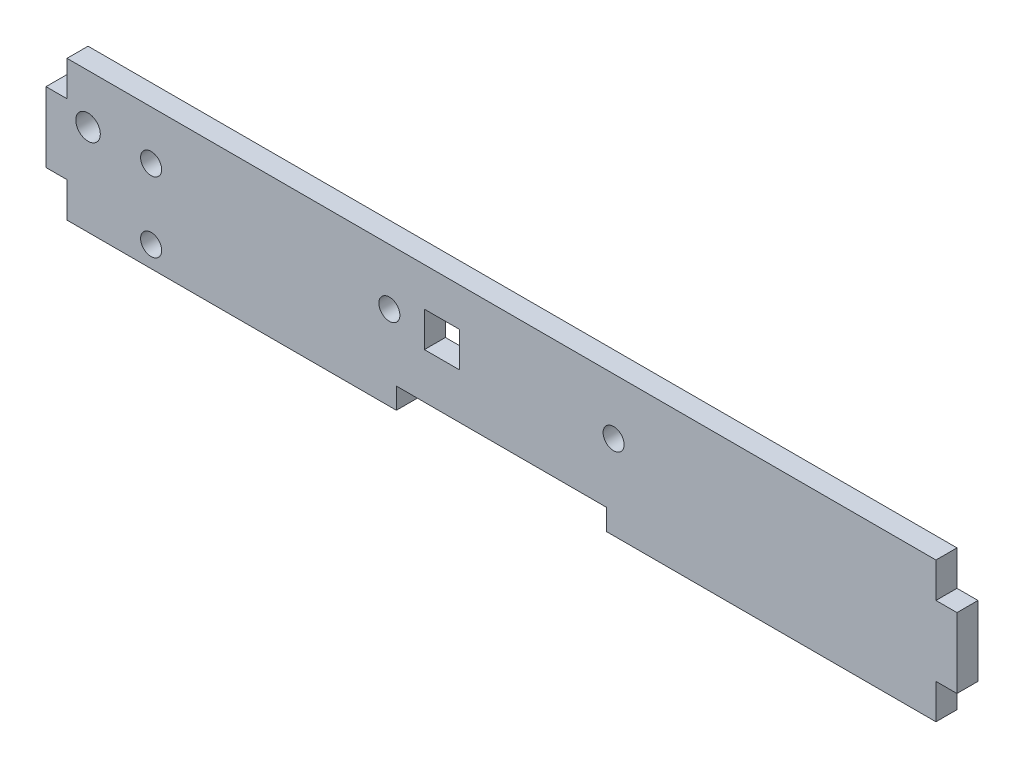
ISO-10303-21;
HEADER;
FILE_DESCRIPTION(('STEP AP214'),'2;1');
FILE_NAME('part.step','',(''),(''),'','','');
FILE_SCHEMA(('AUTOMOTIVE_DESIGN { 1 0 10303 214 1 1 1 1 }'));
ENDSEC;
DATA;
#1=APPLICATION_CONTEXT('core data for automotive mechanical design processes');
#2=APPLICATION_PROTOCOL_DEFINITION('international standard','automotive_design',2000,#1);
#3=PRODUCT_CONTEXT('',#1,'mechanical');
#4=PRODUCT('Part','Part','',(#3));
#5=PRODUCT_RELATED_PRODUCT_CATEGORY('part','',(#4));
#6=PRODUCT_DEFINITION_FORMATION('','',#4);
#7=PRODUCT_DEFINITION_CONTEXT('part definition',#1,'design');
#8=PRODUCT_DEFINITION('design','',#6,#7);
#9=PRODUCT_DEFINITION_SHAPE('','',#8);
#10=(LENGTH_UNIT() NAMED_UNIT(*) SI_UNIT(.MILLI.,.METRE.));
#11=(NAMED_UNIT(*) PLANE_ANGLE_UNIT() SI_UNIT($,.RADIAN.));
#12=(NAMED_UNIT(*) SI_UNIT($,.STERADIAN.) SOLID_ANGLE_UNIT());
#13=UNCERTAINTY_MEASURE_WITH_UNIT(LENGTH_MEASURE(1.E-05),#10,'distance_accuracy_value','');
#14=(GEOMETRIC_REPRESENTATION_CONTEXT(3) GLOBAL_UNCERTAINTY_ASSIGNED_CONTEXT((#13)) GLOBAL_UNIT_ASSIGNED_CONTEXT((#10,
#11,#12)) REPRESENTATION_CONTEXT('',''));
#15=CARTESIAN_POINT('',(0.,0.,0.));
#16=DIRECTION('',(0.,0.,1.));
#17=DIRECTION('',(1.,0.,0.));
#18=AXIS2_PLACEMENT_3D('',#15,#16,#17);
#19=CARTESIAN_POINT('',(0.,10.,3.));
#20=DIRECTION('',(1.,0.,0.));
#21=DIRECTION('',(0.,1.,0.));
#22=AXIS2_PLACEMENT_3D('',#19,#20,#21);
#23=PLANE('',#22);
#24=DIRECTION('',(0.,-1.,0.));
#25=VECTOR('',#24,1.);
#26=CARTESIAN_POINT('',(0.,10.,0.));
#27=LINE('',#26,#25);
#28=CARTESIAN_POINT('',(0.,10.,0.));
#29=VERTEX_POINT('',#28);
#30=CARTESIAN_POINT('',(0.,0.,0.));
#31=VERTEX_POINT('',#30);
#32=EDGE_CURVE('E230',#29,#31,#27,.T.);
#33=ORIENTED_EDGE('',*,*,#32,.T.);
#34=DIRECTION('',(0.,0.,-1.));
#35=VECTOR('',#34,1.);
#36=CARTESIAN_POINT('',(0.,0.,3.));
#37=LINE('',#36,#35);
#38=CARTESIAN_POINT('',(0.,0.,3.));
#39=VERTEX_POINT('',#38);
#40=EDGE_CURVE('E11',#39,#31,#37,.T.);
#41=ORIENTED_EDGE('',*,*,#40,.F.);
#42=DIRECTION('',(0.,-1.,0.));
#43=VECTOR('',#42,1.);
#44=CARTESIAN_POINT('',(0.,10.,3.));
#45=LINE('',#44,#43);
#46=CARTESIAN_POINT('',(0.,10.,3.));
#47=VERTEX_POINT('',#46);
#48=EDGE_CURVE('E233',#47,#39,#45,.T.);
#49=ORIENTED_EDGE('',*,*,#48,.F.);
#50=DIRECTION('',(0.,0.,-1.));
#51=VECTOR('',#50,1.);
#52=CARTESIAN_POINT('',(0.,10.,3.));
#53=LINE('',#52,#51);
#54=EDGE_CURVE('E267',#47,#29,#53,.T.);
#55=ORIENTED_EDGE('',*,*,#54,.T.);
#56=EDGE_LOOP('',(#33,#41,#49,#55));
#57=FACE_BOUND('',#56,.T.);
#58=ADVANCED_FACE('F32',(#57),#23,.F.);
#59=CARTESIAN_POINT('',(0.,0.,3.));
#60=DIRECTION('',(0.,1.,0.));
#61=DIRECTION('',(0.,0.,1.));
#62=AXIS2_PLACEMENT_3D('',#59,#60,#61);
#63=PLANE('',#62);
#64=DIRECTION('',(1.,0.,0.));
#65=VECTOR('',#64,1.);
#66=CARTESIAN_POINT('',(0.,0.,0.));
#67=LINE('',#66,#65);
#68=CARTESIAN_POINT('',(3.,0.,0.));
#69=VERTEX_POINT('',#68);
#70=EDGE_CURVE('E270',#31,#69,#67,.T.);
#71=ORIENTED_EDGE('',*,*,#70,.T.);
#72=DIRECTION('',(0.,0.,-1.));
#73=VECTOR('',#72,1.);
#74=CARTESIAN_POINT('',(3.,0.,3.));
#75=LINE('',#74,#73);
#76=CARTESIAN_POINT('',(3.,0.,3.));
#77=VERTEX_POINT('',#76);
#78=EDGE_CURVE('E39',#77,#69,#75,.T.);
#79=ORIENTED_EDGE('',*,*,#78,.F.);
#80=DIRECTION('',(1.,0.,0.));
#81=VECTOR('',#80,1.);
#82=CARTESIAN_POINT('',(0.,0.,3.));
#83=LINE('',#82,#81);
#84=EDGE_CURVE('E236',#39,#77,#83,.T.);
#85=ORIENTED_EDGE('',*,*,#84,.F.);
#86=ORIENTED_EDGE('',*,*,#40,.T.);
#87=EDGE_LOOP('',(#71,#79,#85,#86));
#88=FACE_BOUND('',#87,.T.);
#89=ADVANCED_FACE('F366',(#88),#63,.F.);
#90=CARTESIAN_POINT('',(3.,0.,3.));
#91=DIRECTION('',(1.,0.,0.));
#92=DIRECTION('',(0.,1.,0.));
#93=AXIS2_PLACEMENT_3D('',#90,#91,#92);
#94=PLANE('',#93);
#95=DIRECTION('',(0.,-1.,0.));
#96=VECTOR('',#95,1.);
#97=CARTESIAN_POINT('',(3.,0.,0.));
#98=LINE('',#97,#96);
#99=CARTESIAN_POINT('',(3.,-5.,0.));
#100=VERTEX_POINT('',#99);
#101=EDGE_CURVE('E272',#69,#100,#98,.T.);
#102=ORIENTED_EDGE('',*,*,#101,.T.);
#103=DIRECTION('',(0.,0.,-1.));
#104=VECTOR('',#103,1.);
#105=CARTESIAN_POINT('',(3.,-5.,3.));
#106=LINE('',#105,#104);
#107=CARTESIAN_POINT('',(3.,-5.,3.));
#108=VERTEX_POINT('',#107);
#109=EDGE_CURVE('E337',#108,#100,#106,.T.);
#110=ORIENTED_EDGE('',*,*,#109,.F.);
#111=DIRECTION('',(0.,-1.,0.));
#112=VECTOR('',#111,1.);
#113=CARTESIAN_POINT('',(3.,0.,3.));
#114=LINE('',#113,#112);
#115=EDGE_CURVE('E239',#77,#108,#114,.T.);
#116=ORIENTED_EDGE('',*,*,#115,.F.);
#117=ORIENTED_EDGE('',*,*,#78,.T.);
#118=EDGE_LOOP('',(#102,#110,#116,#117));
#119=FACE_BOUND('',#118,.T.);
#120=ADVANCED_FACE('F344',(#119),#94,.F.);
#121=CARTESIAN_POINT('',(3.,-5.,3.));
#122=DIRECTION('',(0.,1.,0.));
#123=DIRECTION('',(0.,0.,1.));
#124=AXIS2_PLACEMENT_3D('',#121,#122,#123);
#125=PLANE('',#124);
#126=DIRECTION('',(1.,0.,0.));
#127=VECTOR('',#126,1.);
#128=CARTESIAN_POINT('',(3.,-5.,0.));
#129=LINE('',#128,#127);
#130=CARTESIAN_POINT('',(50.,-5.,0.));
#131=VERTEX_POINT('',#130);
#132=EDGE_CURVE('E274',#100,#131,#129,.T.);
#133=ORIENTED_EDGE('',*,*,#132,.T.);
#134=DIRECTION('',(0.,0.,-1.));
#135=VECTOR('',#134,1.);
#136=CARTESIAN_POINT('',(50.,-5.,3.));
#137=LINE('',#136,#135);
#138=CARTESIAN_POINT('',(50.,-5.,3.));
#139=VERTEX_POINT('',#138);
#140=EDGE_CURVE('E334',#139,#131,#137,.T.);
#141=ORIENTED_EDGE('',*,*,#140,.F.);
#142=DIRECTION('',(1.,0.,0.));
#143=VECTOR('',#142,1.);
#144=CARTESIAN_POINT('',(3.,-5.,3.));
#145=LINE('',#144,#143);
#146=EDGE_CURVE('E241',#108,#139,#145,.T.);
#147=ORIENTED_EDGE('',*,*,#146,.F.);
#148=ORIENTED_EDGE('',*,*,#109,.T.);
#149=EDGE_LOOP('',(#133,#141,#147,#148));
#150=FACE_BOUND('',#149,.T.);
#151=ADVANCED_FACE('F354',(#150),#125,.F.);
#152=CARTESIAN_POINT('',(50.,-5.,3.));
#153=DIRECTION('',(-1.,0.,0.));
#154=DIRECTION('',(0.,0.,1.));
#155=AXIS2_PLACEMENT_3D('',#152,#153,#154);
#156=PLANE('',#155);
#157=DIRECTION('',(0.,1.,0.));
#158=VECTOR('',#157,1.);
#159=CARTESIAN_POINT('',(50.,-5.,0.));
#160=LINE('',#159,#158);
#161=CARTESIAN_POINT('',(50.,-2.,0.));
#162=VERTEX_POINT('',#161);
#163=EDGE_CURVE('E276',#131,#162,#160,.T.);
#164=ORIENTED_EDGE('',*,*,#163,.T.);
#165=DIRECTION('',(0.,0.,-1.));
#166=VECTOR('',#165,1.);
#167=CARTESIAN_POINT('',(50.,-2.,3.));
#168=LINE('',#167,#166);
#169=CARTESIAN_POINT('',(50.,-2.,3.));
#170=VERTEX_POINT('',#169);
#171=EDGE_CURVE('E331',#170,#162,#168,.T.);
#172=ORIENTED_EDGE('',*,*,#171,.F.);
#173=DIRECTION('',(0.,1.,0.));
#174=VECTOR('',#173,1.);
#175=CARTESIAN_POINT('',(50.,-5.,3.));
#176=LINE('',#175,#174);
#177=EDGE_CURVE('E243',#139,#170,#176,.T.);
#178=ORIENTED_EDGE('',*,*,#177,.F.);
#179=ORIENTED_EDGE('',*,*,#140,.T.);
#180=EDGE_LOOP('',(#164,#172,#178,#179));
#181=FACE_BOUND('',#180,.T.);
#182=ADVANCED_FACE('F358',(#181),#156,.F.);
#183=CARTESIAN_POINT('',(50.,-2.,3.));
#184=DIRECTION('',(0.,1.,0.));
#185=DIRECTION('',(-1.,0.,0.));
#186=AXIS2_PLACEMENT_3D('',#183,#184,#185);
#187=PLANE('',#186);
#188=DIRECTION('',(1.,0.,0.));
#189=VECTOR('',#188,1.);
#190=CARTESIAN_POINT('',(50.,-2.,0.));
#191=LINE('',#190,#189);
#192=CARTESIAN_POINT('',(80.,-2.,0.));
#193=VERTEX_POINT('',#192);
#194=EDGE_CURVE('E278',#162,#193,#191,.T.);
#195=ORIENTED_EDGE('',*,*,#194,.T.);
#196=DIRECTION('',(0.,0.,-1.));
#197=VECTOR('',#196,1.);
#198=CARTESIAN_POINT('',(80.,-2.,3.));
#199=LINE('',#198,#197);
#200=CARTESIAN_POINT('',(80.,-2.,3.));
#201=VERTEX_POINT('',#200);
#202=EDGE_CURVE('E328',#201,#193,#199,.T.);
#203=ORIENTED_EDGE('',*,*,#202,.F.);
#204=DIRECTION('',(1.,0.,0.));
#205=VECTOR('',#204,1.);
#206=CARTESIAN_POINT('',(50.,-2.,3.));
#207=LINE('',#206,#205);
#208=EDGE_CURVE('E245',#170,#201,#207,.T.);
#209=ORIENTED_EDGE('',*,*,#208,.F.);
#210=ORIENTED_EDGE('',*,*,#171,.T.);
#211=EDGE_LOOP('',(#195,#203,#209,#210));
#212=FACE_BOUND('',#211,.T.);
#213=ADVANCED_FACE('F419',(#212),#187,.F.);
#214=CARTESIAN_POINT('',(80.,-2.,3.));
#215=DIRECTION('',(1.,0.,0.));
#216=DIRECTION('',(0.,0.,-1.));
#217=AXIS2_PLACEMENT_3D('',#214,#215,#216);
#218=PLANE('',#217);
#219=DIRECTION('',(0.,-1.,0.));
#220=VECTOR('',#219,1.);
#221=CARTESIAN_POINT('',(80.,-2.,0.));
#222=LINE('',#221,#220);
#223=CARTESIAN_POINT('',(80.,-5.,0.));
#224=VERTEX_POINT('',#223);
#225=EDGE_CURVE('E280',#193,#224,#222,.T.);
#226=ORIENTED_EDGE('',*,*,#225,.T.);
#227=DIRECTION('',(0.,0.,-1.));
#228=VECTOR('',#227,1.);
#229=CARTESIAN_POINT('',(80.,-5.,3.));
#230=LINE('',#229,#228);
#231=CARTESIAN_POINT('',(80.,-5.,3.));
#232=VERTEX_POINT('',#231);
#233=EDGE_CURVE('E325',#232,#224,#230,.T.);
#234=ORIENTED_EDGE('',*,*,#233,.F.);
#235=DIRECTION('',(0.,-1.,0.));
#236=VECTOR('',#235,1.);
#237=CARTESIAN_POINT('',(80.,-2.,3.));
#238=LINE('',#237,#236);
#239=EDGE_CURVE('E247',#201,#232,#238,.T.);
#240=ORIENTED_EDGE('',*,*,#239,.F.);
#241=ORIENTED_EDGE('',*,*,#202,.T.);
#242=EDGE_LOOP('',(#226,#234,#240,#241));
#243=FACE_BOUND('',#242,.T.);
#244=ADVANCED_FACE('F416',(#243),#218,.F.);
#245=CARTESIAN_POINT('',(80.,-5.,3.));
#246=DIRECTION('',(0.,1.,0.));
#247=DIRECTION('',(0.,0.,1.));
#248=AXIS2_PLACEMENT_3D('',#245,#246,#247);
#249=PLANE('',#248);
#250=DIRECTION('',(1.,0.,0.));
#251=VECTOR('',#250,1.);
#252=CARTESIAN_POINT('',(80.,-5.,0.));
#253=LINE('',#252,#251);
#254=CARTESIAN_POINT('',(127.,-5.,0.));
#255=VERTEX_POINT('',#254);
#256=EDGE_CURVE('E282',#224,#255,#253,.T.);
#257=ORIENTED_EDGE('',*,*,#256,.T.);
#258=DIRECTION('',(0.,0.,-1.));
#259=VECTOR('',#258,1.);
#260=CARTESIAN_POINT('',(127.,-5.,3.));
#261=LINE('',#260,#259);
#262=CARTESIAN_POINT('',(127.,-5.,3.));
#263=VERTEX_POINT('',#262);
#264=EDGE_CURVE('E322',#263,#255,#261,.T.);
#265=ORIENTED_EDGE('',*,*,#264,.F.);
#266=DIRECTION('',(1.,0.,0.));
#267=VECTOR('',#266,1.);
#268=CARTESIAN_POINT('',(80.,-5.,3.));
#269=LINE('',#268,#267);
#270=EDGE_CURVE('E249',#232,#263,#269,.T.);
#271=ORIENTED_EDGE('',*,*,#270,.F.);
#272=ORIENTED_EDGE('',*,*,#233,.T.);
#273=EDGE_LOOP('',(#257,#265,#271,#272));
#274=FACE_BOUND('',#273,.T.);
#275=ADVANCED_FACE('F412',(#274),#249,.F.);
#276=CARTESIAN_POINT('',(127.,-5.,3.));
#277=DIRECTION('',(-1.,0.,0.));
#278=DIRECTION('',(0.,-1.,0.));
#279=AXIS2_PLACEMENT_3D('',#276,#277,#278);
#280=PLANE('',#279);
#281=DIRECTION('',(0.,1.,0.));
#282=VECTOR('',#281,1.);
#283=CARTESIAN_POINT('',(127.,-5.,0.));
#284=LINE('',#283,#282);
#285=CARTESIAN_POINT('',(127.,0.,0.));
#286=VERTEX_POINT('',#285);
#287=EDGE_CURVE('E284',#255,#286,#284,.T.);
#288=ORIENTED_EDGE('',*,*,#287,.T.);
#289=DIRECTION('',(0.,0.,-1.));
#290=VECTOR('',#289,1.);
#291=CARTESIAN_POINT('',(127.,0.,3.));
#292=LINE('',#291,#290);
#293=CARTESIAN_POINT('',(127.,0.,3.));
#294=VERTEX_POINT('',#293);
#295=EDGE_CURVE('E319',#294,#286,#292,.T.);
#296=ORIENTED_EDGE('',*,*,#295,.F.);
#297=DIRECTION('',(0.,1.,0.));
#298=VECTOR('',#297,1.);
#299=CARTESIAN_POINT('',(127.,-5.,3.));
#300=LINE('',#299,#298);
#301=EDGE_CURVE('E251',#263,#294,#300,.T.);
#302=ORIENTED_EDGE('',*,*,#301,.F.);
#303=ORIENTED_EDGE('',*,*,#264,.T.);
#304=EDGE_LOOP('',(#288,#296,#302,#303));
#305=FACE_BOUND('',#304,.T.);
#306=ADVANCED_FACE('F408',(#305),#280,.F.);
#307=CARTESIAN_POINT('',(127.,0.,3.));
#308=DIRECTION('',(0.,1.,0.));
#309=DIRECTION('',(0.,0.,1.));
#310=AXIS2_PLACEMENT_3D('',#307,#308,#309);
#311=PLANE('',#310);
#312=DIRECTION('',(1.,0.,0.));
#313=VECTOR('',#312,1.);
#314=CARTESIAN_POINT('',(127.,0.,0.));
#315=LINE('',#314,#313);
#316=CARTESIAN_POINT('',(130.,0.,0.));
#317=VERTEX_POINT('',#316);
#318=EDGE_CURVE('E286',#286,#317,#315,.T.);
#319=ORIENTED_EDGE('',*,*,#318,.T.);
#320=DIRECTION('',(0.,0.,-1.));
#321=VECTOR('',#320,1.);
#322=CARTESIAN_POINT('',(130.,0.,3.));
#323=LINE('',#322,#321);
#324=CARTESIAN_POINT('',(130.,0.,3.));
#325=VERTEX_POINT('',#324);
#326=EDGE_CURVE('E316',#325,#317,#323,.T.);
#327=ORIENTED_EDGE('',*,*,#326,.F.);
#328=DIRECTION('',(1.,0.,0.));
#329=VECTOR('',#328,1.);
#330=CARTESIAN_POINT('',(127.,0.,3.));
#331=LINE('',#330,#329);
#332=EDGE_CURVE('E253',#294,#325,#331,.T.);
#333=ORIENTED_EDGE('',*,*,#332,.F.);
#334=ORIENTED_EDGE('',*,*,#295,.T.);
#335=EDGE_LOOP('',(#319,#327,#333,#334));
#336=FACE_BOUND('',#335,.T.);
#337=ADVANCED_FACE('F403',(#336),#311,.F.);
#338=CARTESIAN_POINT('',(130.,0.,3.));
#339=DIRECTION('',(-1.,0.,0.));
#340=DIRECTION('',(0.,0.,1.));
#341=AXIS2_PLACEMENT_3D('',#338,#339,#340);
#342=PLANE('',#341);
#343=DIRECTION('',(0.,1.,0.));
#344=VECTOR('',#343,1.);
#345=CARTESIAN_POINT('',(130.,0.,0.));
#346=LINE('',#345,#344);
#347=CARTESIAN_POINT('',(130.,10.,0.));
#348=VERTEX_POINT('',#347);
#349=EDGE_CURVE('E288',#317,#348,#346,.T.);
#350=ORIENTED_EDGE('',*,*,#349,.T.);
#351=DIRECTION('',(0.,0.,-1.));
#352=VECTOR('',#351,1.);
#353=CARTESIAN_POINT('',(130.,10.,3.));
#354=LINE('',#353,#352);
#355=CARTESIAN_POINT('',(130.,10.,3.));
#356=VERTEX_POINT('',#355);
#357=EDGE_CURVE('E313',#356,#348,#354,.T.);
#358=ORIENTED_EDGE('',*,*,#357,.F.);
#359=DIRECTION('',(0.,1.,0.));
#360=VECTOR('',#359,1.);
#361=CARTESIAN_POINT('',(130.,0.,3.));
#362=LINE('',#361,#360);
#363=EDGE_CURVE('E255',#325,#356,#362,.T.);
#364=ORIENTED_EDGE('',*,*,#363,.F.);
#365=ORIENTED_EDGE('',*,*,#326,.T.);
#366=EDGE_LOOP('',(#350,#358,#364,#365));
#367=FACE_BOUND('',#366,.T.);
#368=ADVANCED_FACE('F397',(#367),#342,.F.);
#369=CARTESIAN_POINT('',(130.,10.,3.));
#370=DIRECTION('',(0.,-1.,0.));
#371=DIRECTION('',(0.,0.,-1.));
#372=AXIS2_PLACEMENT_3D('',#369,#370,#371);
#373=PLANE('',#372);
#374=DIRECTION('',(-1.,0.,0.));
#375=VECTOR('',#374,1.);
#376=CARTESIAN_POINT('',(130.,10.,0.));
#377=LINE('',#376,#375);
#378=CARTESIAN_POINT('',(127.,10.,0.));
#379=VERTEX_POINT('',#378);
#380=EDGE_CURVE('E290',#348,#379,#377,.T.);
#381=ORIENTED_EDGE('',*,*,#380,.T.);
#382=DIRECTION('',(0.,0.,-1.));
#383=VECTOR('',#382,1.);
#384=CARTESIAN_POINT('',(127.,10.,3.));
#385=LINE('',#384,#383);
#386=CARTESIAN_POINT('',(127.,10.,3.));
#387=VERTEX_POINT('',#386);
#388=EDGE_CURVE('E310',#387,#379,#385,.T.);
#389=ORIENTED_EDGE('',*,*,#388,.F.);
#390=DIRECTION('',(-1.,0.,0.));
#391=VECTOR('',#390,1.);
#392=CARTESIAN_POINT('',(130.,10.,3.));
#393=LINE('',#392,#391);
#394=EDGE_CURVE('E257',#356,#387,#393,.T.);
#395=ORIENTED_EDGE('',*,*,#394,.F.);
#396=ORIENTED_EDGE('',*,*,#357,.T.);
#397=EDGE_LOOP('',(#381,#389,#395,#396));
#398=FACE_BOUND('',#397,.T.);
#399=ADVANCED_FACE('F393',(#398),#373,.F.);
#400=CARTESIAN_POINT('',(127.,10.,3.));
#401=DIRECTION('',(-1.,0.,0.));
#402=DIRECTION('',(0.,0.,1.));
#403=AXIS2_PLACEMENT_3D('',#400,#401,#402);
#404=PLANE('',#403);
#405=DIRECTION('',(0.,1.,0.));
#406=VECTOR('',#405,1.);
#407=CARTESIAN_POINT('',(127.,10.,0.));
#408=LINE('',#407,#406);
#409=CARTESIAN_POINT('',(127.,15.,0.));
#410=VERTEX_POINT('',#409);
#411=EDGE_CURVE('E292',#379,#410,#408,.T.);
#412=ORIENTED_EDGE('',*,*,#411,.T.);
#413=DIRECTION('',(0.,0.,-1.));
#414=VECTOR('',#413,1.);
#415=CARTESIAN_POINT('',(127.,15.,3.));
#416=LINE('',#415,#414);
#417=CARTESIAN_POINT('',(127.,15.,3.));
#418=VERTEX_POINT('',#417);
#419=EDGE_CURVE('E307',#418,#410,#416,.T.);
#420=ORIENTED_EDGE('',*,*,#419,.F.);
#421=DIRECTION('',(0.,1.,0.));
#422=VECTOR('',#421,1.);
#423=CARTESIAN_POINT('',(127.,10.,3.));
#424=LINE('',#423,#422);
#425=EDGE_CURVE('E259',#387,#418,#424,.T.);
#426=ORIENTED_EDGE('',*,*,#425,.F.);
#427=ORIENTED_EDGE('',*,*,#388,.T.);
#428=EDGE_LOOP('',(#412,#420,#426,#427));
#429=FACE_BOUND('',#428,.T.);
#430=ADVANCED_FACE('F388',(#429),#404,.F.);
#431=CARTESIAN_POINT('',(127.,15.,3.));
#432=DIRECTION('',(0.,-1.,0.));
#433=DIRECTION('',(1.,0.,0.));
#434=AXIS2_PLACEMENT_3D('',#431,#432,#433);
#435=PLANE('',#434);
#436=DIRECTION('',(-1.,0.,0.));
#437=VECTOR('',#436,1.);
#438=CARTESIAN_POINT('',(127.,15.,0.));
#439=LINE('',#438,#437);
#440=CARTESIAN_POINT('',(3.,15.,0.));
#441=VERTEX_POINT('',#440);
#442=EDGE_CURVE('E294',#410,#441,#439,.T.);
#443=ORIENTED_EDGE('',*,*,#442,.T.);
#444=DIRECTION('',(0.,0.,-1.));
#445=VECTOR('',#444,1.);
#446=CARTESIAN_POINT('',(3.,15.,3.));
#447=LINE('',#446,#445);
#448=CARTESIAN_POINT('',(3.,15.,3.));
#449=VERTEX_POINT('',#448);
#450=EDGE_CURVE('E304',#449,#441,#447,.T.);
#451=ORIENTED_EDGE('',*,*,#450,.F.);
#452=DIRECTION('',(-1.,0.,0.));
#453=VECTOR('',#452,1.);
#454=CARTESIAN_POINT('',(127.,15.,3.));
#455=LINE('',#454,#453);
#456=EDGE_CURVE('E261',#418,#449,#455,.T.);
#457=ORIENTED_EDGE('',*,*,#456,.F.);
#458=ORIENTED_EDGE('',*,*,#419,.T.);
#459=EDGE_LOOP('',(#443,#451,#457,#458));
#460=FACE_BOUND('',#459,.T.);
#461=ADVANCED_FACE('F382',(#460),#435,.F.);
#462=CARTESIAN_POINT('',(3.,15.,3.));
#463=DIRECTION('',(1.,0.,0.));
#464=DIRECTION('',(0.,1.,0.));
#465=AXIS2_PLACEMENT_3D('',#462,#463,#464);
#466=PLANE('',#465);
#467=DIRECTION('',(0.,-1.,0.));
#468=VECTOR('',#467,1.);
#469=CARTESIAN_POINT('',(3.,15.,0.));
#470=LINE('',#469,#468);
#471=CARTESIAN_POINT('',(3.,10.,0.));
#472=VERTEX_POINT('',#471);
#473=EDGE_CURVE('E296',#441,#472,#470,.T.);
#474=ORIENTED_EDGE('',*,*,#473,.T.);
#475=DIRECTION('',(0.,0.,-1.));
#476=VECTOR('',#475,1.);
#477=CARTESIAN_POINT('',(3.,10.,3.));
#478=LINE('',#477,#476);
#479=CARTESIAN_POINT('',(3.,10.,3.));
#480=VERTEX_POINT('',#479);
#481=EDGE_CURVE('E301',#480,#472,#478,.T.);
#482=ORIENTED_EDGE('',*,*,#481,.F.);
#483=DIRECTION('',(0.,-1.,0.));
#484=VECTOR('',#483,1.);
#485=CARTESIAN_POINT('',(3.,15.,3.));
#486=LINE('',#485,#484);
#487=EDGE_CURVE('E263',#449,#480,#486,.T.);
#488=ORIENTED_EDGE('',*,*,#487,.F.);
#489=ORIENTED_EDGE('',*,*,#450,.T.);
#490=EDGE_LOOP('',(#474,#482,#488,#489));
#491=FACE_BOUND('',#490,.T.);
#492=ADVANCED_FACE('F378',(#491),#466,.F.);
#493=CARTESIAN_POINT('',(3.,10.,3.));
#494=DIRECTION('',(0.,-1.,0.));
#495=DIRECTION('',(0.,0.,-1.));
#496=AXIS2_PLACEMENT_3D('',#493,#494,#495);
#497=PLANE('',#496);
#498=DIRECTION('',(-1.,0.,0.));
#499=VECTOR('',#498,1.);
#500=CARTESIAN_POINT('',(3.,10.,0.));
#501=LINE('',#500,#499);
#502=EDGE_CURVE('E237',#472,#29,#501,.T.);
#503=ORIENTED_EDGE('',*,*,#502,.T.);
#504=ORIENTED_EDGE('',*,*,#54,.F.);
#505=DIRECTION('',(-1.,0.,0.));
#506=VECTOR('',#505,1.);
#507=CARTESIAN_POINT('',(3.,10.,3.));
#508=LINE('',#507,#506);
#509=EDGE_CURVE('E265',#480,#47,#508,.T.);
#510=ORIENTED_EDGE('',*,*,#509,.F.);
#511=ORIENTED_EDGE('',*,*,#481,.T.);
#512=EDGE_LOOP('',(#503,#504,#510,#511));
#513=FACE_BOUND('',#512,.T.);
#514=ADVANCED_FACE('F373',(#513),#497,.F.);
#515=CARTESIAN_POINT('',(0.,0.,3.));
#516=DIRECTION('',(0.,0.,1.));
#517=DIRECTION('',(1.,0.,0.));
#518=AXIS2_PLACEMENT_3D('',#515,#516,#517);
#519=PLANE('',#518);
#520=CARTESIAN_POINT('',(81.,7.00000000000002,3.));
#521=DIRECTION('',(0.,0.,1.));
#522=DIRECTION('',(1.,0.,0.));
#523=AXIS2_PLACEMENT_3D('',#520,#521,#522);
#524=CIRCLE('',#523,1.5);
#525=CARTESIAN_POINT('',(82.5,7.00000000000002,3.));
#526=VERTEX_POINT('',#525);
#527=EDGE_CURVE('E192',#526,#526,#524,.T.);
#528=ORIENTED_EDGE('',*,*,#527,.F.);
#529=EDGE_LOOP('',(#528));
#530=FACE_BOUND('',#529,.T.);
#531=DIRECTION('',(0.,-1.,0.));
#532=VECTOR('',#531,1.);
#533=CARTESIAN_POINT('',(54.,9.50000000000002,3.));
#534=LINE('',#533,#532);
#535=CARTESIAN_POINT('',(54.,9.50000000000002,3.));
#536=VERTEX_POINT('',#535);
#537=CARTESIAN_POINT('',(54.,4.50000000000002,3.));
#538=VERTEX_POINT('',#537);
#539=EDGE_CURVE('E46',#536,#538,#534,.T.);
#540=ORIENTED_EDGE('',*,*,#539,.F.);
#541=DIRECTION('',(-1.,0.,0.));
#542=VECTOR('',#541,1.);
#543=CARTESIAN_POINT('',(54.,9.50000000000002,3.));
#544=LINE('',#543,#542);
#545=CARTESIAN_POINT('',(59.,9.50000000000002,3.));
#546=VERTEX_POINT('',#545);
#547=EDGE_CURVE('E186',#546,#536,#544,.T.);
#548=ORIENTED_EDGE('',*,*,#547,.F.);
#549=DIRECTION('',(0.,1.,0.));
#550=VECTOR('',#549,1.);
#551=CARTESIAN_POINT('',(59.,9.50000000000002,3.));
#552=LINE('',#551,#550);
#553=CARTESIAN_POINT('',(59.,4.50000000000002,3.));
#554=VERTEX_POINT('',#553);
#555=EDGE_CURVE('E189',#554,#546,#552,.T.);
#556=ORIENTED_EDGE('',*,*,#555,.F.);
#557=DIRECTION('',(1.,0.,0.));
#558=VECTOR('',#557,1.);
#559=CARTESIAN_POINT('',(54.,4.50000000000002,3.));
#560=LINE('',#559,#558);
#561=EDGE_CURVE('E198',#538,#554,#560,.T.);
#562=ORIENTED_EDGE('',*,*,#561,.F.);
#563=EDGE_LOOP('',(#540,#548,#556,#562));
#564=FACE_BOUND('',#563,.T.);
#565=CARTESIAN_POINT('',(49.,7.00000000000002,3.));
#566=DIRECTION('',(0.,0.,1.));
#567=DIRECTION('',(1.,0.,0.));
#568=AXIS2_PLACEMENT_3D('',#565,#566,#567);
#569=CIRCLE('',#568,1.5);
#570=CARTESIAN_POINT('',(50.5,7.00000000000002,3.));
#571=VERTEX_POINT('',#570);
#572=EDGE_CURVE('E211',#571,#571,#569,.T.);
#573=ORIENTED_EDGE('',*,*,#572,.F.);
#574=EDGE_LOOP('',(#573));
#575=FACE_BOUND('',#574,.T.);
#576=CARTESIAN_POINT('',(15.,-2.,3.));
#577=DIRECTION('',(0.,0.,1.));
#578=DIRECTION('',(1.,0.,0.));
#579=AXIS2_PLACEMENT_3D('',#576,#577,#578);
#580=CIRCLE('',#579,1.5);
#581=CARTESIAN_POINT('',(16.5,-2.,3.));
#582=VERTEX_POINT('',#581);
#583=EDGE_CURVE('E219',#582,#582,#580,.T.);
#584=ORIENTED_EDGE('',*,*,#583,.F.);
#585=EDGE_LOOP('',(#584));
#586=FACE_BOUND('',#585,.T.);
#587=CARTESIAN_POINT('',(6.,8.00000000000001,3.));
#588=DIRECTION('',(0.,0.,1.));
#589=DIRECTION('',(1.,0.,0.));
#590=AXIS2_PLACEMENT_3D('',#587,#588,#589);
#591=CIRCLE('',#590,1.75);
#592=CARTESIAN_POINT('',(7.75,8.00000000000001,3.));
#593=VERTEX_POINT('',#592);
#594=EDGE_CURVE('E210',#593,#593,#591,.T.);
#595=ORIENTED_EDGE('',*,*,#594,.F.);
#596=EDGE_LOOP('',(#595));
#597=FACE_BOUND('',#596,.T.);
#598=CARTESIAN_POINT('',(15.,8.,3.));
#599=DIRECTION('',(0.,0.,1.));
#600=DIRECTION('',(1.,0.,0.));
#601=AXIS2_PLACEMENT_3D('',#598,#599,#600);
#602=CIRCLE('',#601,1.5);
#603=CARTESIAN_POINT('',(16.5,8.,3.));
#604=VERTEX_POINT('',#603);
#605=EDGE_CURVE('E218',#604,#604,#602,.T.);
#606=ORIENTED_EDGE('',*,*,#605,.F.);
#607=EDGE_LOOP('',(#606));
#608=FACE_BOUND('',#607,.T.);
#609=ORIENTED_EDGE('',*,*,#48,.T.);
#610=ORIENTED_EDGE('',*,*,#84,.T.);
#611=ORIENTED_EDGE('',*,*,#115,.T.);
#612=ORIENTED_EDGE('',*,*,#146,.T.);
#613=ORIENTED_EDGE('',*,*,#177,.T.);
#614=ORIENTED_EDGE('',*,*,#208,.T.);
#615=ORIENTED_EDGE('',*,*,#239,.T.);
#616=ORIENTED_EDGE('',*,*,#270,.T.);
#617=ORIENTED_EDGE('',*,*,#301,.T.);
#618=ORIENTED_EDGE('',*,*,#332,.T.);
#619=ORIENTED_EDGE('',*,*,#363,.T.);
#620=ORIENTED_EDGE('',*,*,#394,.T.);
#621=ORIENTED_EDGE('',*,*,#425,.T.);
#622=ORIENTED_EDGE('',*,*,#456,.T.);
#623=ORIENTED_EDGE('',*,*,#487,.T.);
#624=ORIENTED_EDGE('',*,*,#509,.T.);
#625=EDGE_LOOP('',(#609,#610,#611,#612,#613,#614,#615,#616,#617,#618,#619,#620,#621,#622,#623,#624));
#626=FACE_BOUND('',#625,.T.);
#627=ADVANCED_FACE('F362',(#530,#564,#575,#586,#597,#608,#626),#519,.T.);
#628=CARTESIAN_POINT('',(0.,0.,0.));
#629=DIRECTION('',(0.,0.,1.));
#630=DIRECTION('',(1.,0.,0.));
#631=AXIS2_PLACEMENT_3D('',#628,#629,#630);
#632=PLANE('',#631);
#633=CARTESIAN_POINT('',(81.,7.00000000000002,0.));
#634=DIRECTION('',(0.,0.,1.));
#635=DIRECTION('',(1.,0.,0.));
#636=AXIS2_PLACEMENT_3D('',#633,#634,#635);
#637=CIRCLE('',#636,1.5);
#638=CARTESIAN_POINT('',(82.5,7.00000000000002,0.));
#639=VERTEX_POINT('',#638);
#640=EDGE_CURVE('E214',#639,#639,#637,.T.);
#641=ORIENTED_EDGE('',*,*,#640,.T.);
#642=EDGE_LOOP('',(#641));
#643=FACE_BOUND('',#642,.T.);
#644=DIRECTION('',(-1.,0.,0.));
#645=VECTOR('',#644,1.);
#646=CARTESIAN_POINT('',(54.,9.50000000000002,0.));
#647=LINE('',#646,#645);
#648=CARTESIAN_POINT('',(59.,9.50000000000002,0.));
#649=VERTEX_POINT('',#648);
#650=CARTESIAN_POINT('',(54.,9.50000000000002,0.));
#651=VERTEX_POINT('',#650);
#652=EDGE_CURVE('E176',#649,#651,#647,.T.);
#653=ORIENTED_EDGE('',*,*,#652,.T.);
#654=DIRECTION('',(0.,-1.,0.));
#655=VECTOR('',#654,1.);
#656=CARTESIAN_POINT('',(54.,9.50000000000002,0.));
#657=LINE('',#656,#655);
#658=CARTESIAN_POINT('',(54.,4.50000000000002,0.));
#659=VERTEX_POINT('',#658);
#660=EDGE_CURVE('E170',#651,#659,#657,.T.);
#661=ORIENTED_EDGE('',*,*,#660,.T.);
#662=DIRECTION('',(1.,0.,0.));
#663=VECTOR('',#662,1.);
#664=CARTESIAN_POINT('',(54.,4.50000000000002,0.));
#665=LINE('',#664,#663);
#666=CARTESIAN_POINT('',(59.,4.50000000000002,0.));
#667=VERTEX_POINT('',#666);
#668=EDGE_CURVE('E179',#659,#667,#665,.T.);
#669=ORIENTED_EDGE('',*,*,#668,.T.);
#670=DIRECTION('',(0.,1.,0.));
#671=VECTOR('',#670,1.);
#672=CARTESIAN_POINT('',(59.,9.50000000000002,0.));
#673=LINE('',#672,#671);
#674=EDGE_CURVE('E54',#667,#649,#673,.T.);
#675=ORIENTED_EDGE('',*,*,#674,.T.);
#676=EDGE_LOOP('',(#653,#661,#669,#675));
#677=FACE_BOUND('',#676,.T.);
#678=CARTESIAN_POINT('',(49.,7.00000000000002,0.));
#679=DIRECTION('',(0.,0.,1.));
#680=DIRECTION('',(1.,0.,0.));
#681=AXIS2_PLACEMENT_3D('',#678,#679,#680);
#682=CIRCLE('',#681,1.5);
#683=CARTESIAN_POINT('',(50.5,7.00000000000002,0.));
#684=VERTEX_POINT('',#683);
#685=EDGE_CURVE('E207',#684,#684,#682,.T.);
#686=ORIENTED_EDGE('',*,*,#685,.T.);
#687=EDGE_LOOP('',(#686));
#688=FACE_BOUND('',#687,.T.);
#689=CARTESIAN_POINT('',(15.,-2.,0.));
#690=DIRECTION('',(0.,0.,1.));
#691=DIRECTION('',(1.,0.,0.));
#692=AXIS2_PLACEMENT_3D('',#689,#690,#691);
#693=CIRCLE('',#692,1.5);
#694=CARTESIAN_POINT('',(16.5,-2.,0.));
#695=VERTEX_POINT('',#694);
#696=EDGE_CURVE('E215',#695,#695,#693,.T.);
#697=ORIENTED_EDGE('',*,*,#696,.T.);
#698=EDGE_LOOP('',(#697));
#699=FACE_BOUND('',#698,.T.);
#700=CARTESIAN_POINT('',(6.,8.00000000000001,0.));
#701=DIRECTION('',(0.,0.,1.));
#702=DIRECTION('',(1.,0.,0.));
#703=AXIS2_PLACEMENT_3D('',#700,#701,#702);
#704=CIRCLE('',#703,1.75);
#705=CARTESIAN_POINT('',(7.75,8.00000000000001,0.));
#706=VERTEX_POINT('',#705);
#707=EDGE_CURVE('E222',#706,#706,#704,.T.);
#708=ORIENTED_EDGE('',*,*,#707,.T.);
#709=EDGE_LOOP('',(#708));
#710=FACE_BOUND('',#709,.T.);
#711=CARTESIAN_POINT('',(15.,8.,0.));
#712=DIRECTION('',(0.,0.,1.));
#713=DIRECTION('',(1.,0.,0.));
#714=AXIS2_PLACEMENT_3D('',#711,#712,#713);
#715=CIRCLE('',#714,1.5);
#716=CARTESIAN_POINT('',(16.5,8.,0.));
#717=VERTEX_POINT('',#716);
#718=EDGE_CURVE('E227',#717,#717,#715,.T.);
#719=ORIENTED_EDGE('',*,*,#718,.T.);
#720=EDGE_LOOP('',(#719));
#721=FACE_BOUND('',#720,.T.);
#722=ORIENTED_EDGE('',*,*,#32,.F.);
#723=ORIENTED_EDGE('',*,*,#502,.F.);
#724=ORIENTED_EDGE('',*,*,#473,.F.);
#725=ORIENTED_EDGE('',*,*,#442,.F.);
#726=ORIENTED_EDGE('',*,*,#411,.F.);
#727=ORIENTED_EDGE('',*,*,#380,.F.);
#728=ORIENTED_EDGE('',*,*,#349,.F.);
#729=ORIENTED_EDGE('',*,*,#318,.F.);
#730=ORIENTED_EDGE('',*,*,#287,.F.);
#731=ORIENTED_EDGE('',*,*,#256,.F.);
#732=ORIENTED_EDGE('',*,*,#225,.F.);
#733=ORIENTED_EDGE('',*,*,#194,.F.);
#734=ORIENTED_EDGE('',*,*,#163,.F.);
#735=ORIENTED_EDGE('',*,*,#132,.F.);
#736=ORIENTED_EDGE('',*,*,#101,.F.);
#737=ORIENTED_EDGE('',*,*,#70,.F.);
#738=EDGE_LOOP('',(#722,#723,#724,#725,#726,#727,#728,#729,#730,#731,#732,#733,#734,#735,#736,#737));
#739=FACE_BOUND('',#738,.T.);
#740=ADVANCED_FACE('F183',(#643,#677,#688,#699,#710,#721,#739),#632,.F.);
#741=CARTESIAN_POINT('',(15.,8.,0.));
#742=DIRECTION('',(0.,0.,1.));
#743=DIRECTION('',(1.,0.,0.));
#744=AXIS2_PLACEMENT_3D('',#741,#742,#743);
#745=CYLINDRICAL_SURFACE('',#744,1.5);
#746=ORIENTED_EDGE('',*,*,#718,.F.);
#747=EDGE_LOOP('',(#746));
#748=FACE_BOUND('',#747,.T.);
#749=ORIENTED_EDGE('',*,*,#605,.T.);
#750=EDGE_LOOP('',(#749));
#751=FACE_BOUND('',#750,.T.);
#752=ADVANCED_FACE('F535',(#748,#751),#745,.F.);
#753=CARTESIAN_POINT('',(6.,8.00000000000001,0.));
#754=DIRECTION('',(0.,0.,1.));
#755=DIRECTION('',(1.,0.,0.));
#756=AXIS2_PLACEMENT_3D('',#753,#754,#755);
#757=CYLINDRICAL_SURFACE('',#756,1.75);
#758=ORIENTED_EDGE('',*,*,#707,.F.);
#759=EDGE_LOOP('',(#758));
#760=FACE_BOUND('',#759,.T.);
#761=ORIENTED_EDGE('',*,*,#594,.T.);
#762=EDGE_LOOP('',(#761));
#763=FACE_BOUND('',#762,.T.);
#764=ADVANCED_FACE('F540',(#760,#763),#757,.F.);
#765=CARTESIAN_POINT('',(15.,-2.,0.));
#766=DIRECTION('',(0.,0.,1.));
#767=DIRECTION('',(1.,0.,0.));
#768=AXIS2_PLACEMENT_3D('',#765,#766,#767);
#769=CYLINDRICAL_SURFACE('',#768,1.5);
#770=ORIENTED_EDGE('',*,*,#696,.F.);
#771=EDGE_LOOP('',(#770));
#772=FACE_BOUND('',#771,.T.);
#773=ORIENTED_EDGE('',*,*,#583,.T.);
#774=EDGE_LOOP('',(#773));
#775=FACE_BOUND('',#774,.T.);
#776=ADVANCED_FACE('F552',(#772,#775),#769,.F.);
#777=CARTESIAN_POINT('',(49.,7.00000000000002,0.));
#778=DIRECTION('',(0.,0.,1.));
#779=DIRECTION('',(1.,0.,0.));
#780=AXIS2_PLACEMENT_3D('',#777,#778,#779);
#781=CYLINDRICAL_SURFACE('',#780,1.5);
#782=ORIENTED_EDGE('',*,*,#685,.F.);
#783=EDGE_LOOP('',(#782));
#784=FACE_BOUND('',#783,.T.);
#785=ORIENTED_EDGE('',*,*,#572,.T.);
#786=EDGE_LOOP('',(#785));
#787=FACE_BOUND('',#786,.T.);
#788=ADVANCED_FACE('F562',(#784,#787),#781,.F.);
#789=CARTESIAN_POINT('',(54.,9.50000000000002,0.));
#790=DIRECTION('',(-1.,0.,0.));
#791=DIRECTION('',(0.,-1.,0.));
#792=AXIS2_PLACEMENT_3D('',#789,#790,#791);
#793=PLANE('',#792);
#794=ORIENTED_EDGE('',*,*,#539,.T.);
#795=DIRECTION('',(0.,0.,1.));
#796=VECTOR('',#795,1.);
#797=CARTESIAN_POINT('',(54.,4.50000000000002,0.));
#798=LINE('',#797,#796);
#799=EDGE_CURVE('E166',#659,#538,#798,.T.);
#800=ORIENTED_EDGE('',*,*,#799,.F.);
#801=ORIENTED_EDGE('',*,*,#660,.F.);
#802=DIRECTION('',(0.,0.,1.));
#803=VECTOR('',#802,1.);
#804=CARTESIAN_POINT('',(54.,9.50000000000002,0.));
#805=LINE('',#804,#803);
#806=EDGE_CURVE('E202',#651,#536,#805,.T.);
#807=ORIENTED_EDGE('',*,*,#806,.T.);
#808=EDGE_LOOP('',(#794,#800,#801,#807));
#809=FACE_BOUND('',#808,.T.);
#810=ADVANCED_FACE('F168',(#809),#793,.F.);
#811=CARTESIAN_POINT('',(54.,9.50000000000002,0.));
#812=DIRECTION('',(0.,1.,0.));
#813=DIRECTION('',(0.,0.,1.));
#814=AXIS2_PLACEMENT_3D('',#811,#812,#813);
#815=PLANE('',#814);
#816=ORIENTED_EDGE('',*,*,#547,.T.);
#817=ORIENTED_EDGE('',*,*,#806,.F.);
#818=ORIENTED_EDGE('',*,*,#652,.F.);
#819=DIRECTION('',(0.,0.,1.));
#820=VECTOR('',#819,1.);
#821=CARTESIAN_POINT('',(59.,9.50000000000002,0.));
#822=LINE('',#821,#820);
#823=EDGE_CURVE('E204',#649,#546,#822,.T.);
#824=ORIENTED_EDGE('',*,*,#823,.T.);
#825=EDGE_LOOP('',(#816,#817,#818,#824));
#826=FACE_BOUND('',#825,.T.);
#827=ADVANCED_FACE('F595',(#826),#815,.F.);
#828=CARTESIAN_POINT('',(59.,9.50000000000002,0.));
#829=DIRECTION('',(1.,0.,0.));
#830=DIRECTION('',(0.,1.,0.));
#831=AXIS2_PLACEMENT_3D('',#828,#829,#830);
#832=PLANE('',#831);
#833=ORIENTED_EDGE('',*,*,#555,.T.);
#834=ORIENTED_EDGE('',*,*,#823,.F.);
#835=ORIENTED_EDGE('',*,*,#674,.F.);
#836=DIRECTION('',(0.,0.,1.));
#837=VECTOR('',#836,1.);
#838=CARTESIAN_POINT('',(59.,4.50000000000002,0.));
#839=LINE('',#838,#837);
#840=EDGE_CURVE('E175',#667,#554,#839,.T.);
#841=ORIENTED_EDGE('',*,*,#840,.T.);
#842=EDGE_LOOP('',(#833,#834,#835,#841));
#843=FACE_BOUND('',#842,.T.);
#844=ADVANCED_FACE('F604',(#843),#832,.F.);
#845=CARTESIAN_POINT('',(54.,4.50000000000002,0.));
#846=DIRECTION('',(0.,-1.,0.));
#847=DIRECTION('',(0.,0.,-1.));
#848=AXIS2_PLACEMENT_3D('',#845,#846,#847);
#849=PLANE('',#848);
#850=ORIENTED_EDGE('',*,*,#561,.T.);
#851=ORIENTED_EDGE('',*,*,#840,.F.);
#852=ORIENTED_EDGE('',*,*,#668,.F.);
#853=ORIENTED_EDGE('',*,*,#799,.T.);
#854=EDGE_LOOP('',(#850,#851,#852,#853));
#855=FACE_BOUND('',#854,.T.);
#856=ADVANCED_FACE('F180',(#855),#849,.F.);
#857=CARTESIAN_POINT('',(81.,7.00000000000002,0.));
#858=DIRECTION('',(0.,0.,1.));
#859=DIRECTION('',(1.,0.,0.));
#860=AXIS2_PLACEMENT_3D('',#857,#858,#859);
#861=CYLINDRICAL_SURFACE('',#860,1.5);
#862=ORIENTED_EDGE('',*,*,#640,.F.);
#863=EDGE_LOOP('',(#862));
#864=FACE_BOUND('',#863,.T.);
#865=ORIENTED_EDGE('',*,*,#527,.T.);
#866=EDGE_LOOP('',(#865));
#867=FACE_BOUND('',#866,.T.);
#868=ADVANCED_FACE('F622',(#864,#867),#861,.F.);
#869=CLOSED_SHELL('',(#58,#89,#120,#151,#182,#213,#244,#275,#306,#337,#368,#399,#430,#461,#492,
#514,#627,#740,#752,#764,#776,#788,#810,#827,#844,#856,#868));
#870=MANIFOLD_SOLID_BREP('B2',#869);
#871=ADVANCED_BREP_SHAPE_REPRESENTATION('',(#18,#870),#14);
#872=SHAPE_DEFINITION_REPRESENTATION(#9,#871);
ENDSEC;
END-ISO-10303-21;
